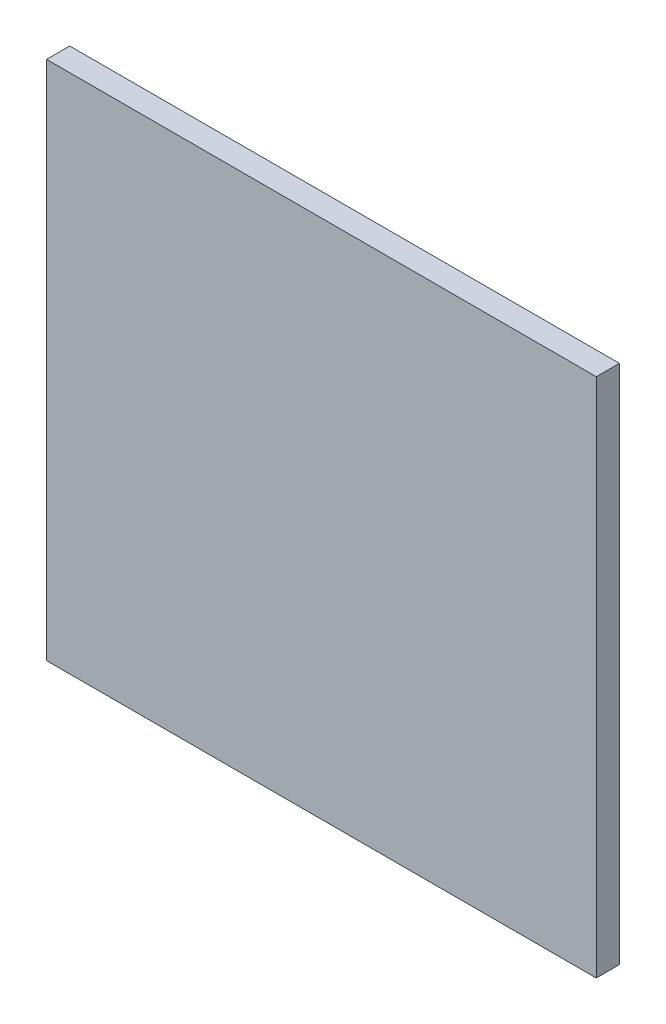
ISO-10303-21;
HEADER;
FILE_DESCRIPTION(('STEP AP214'),'2;1');
FILE_NAME('part.step','',(''),(''),'','','');
FILE_SCHEMA(('AUTOMOTIVE_DESIGN { 1 0 10303 214 1 1 1 1 }'));
ENDSEC;
DATA;
#1=APPLICATION_CONTEXT('core data for automotive mechanical design processes');
#2=APPLICATION_PROTOCOL_DEFINITION('international standard','automotive_design',2000,#1);
#3=PRODUCT_CONTEXT('',#1,'mechanical');
#4=PRODUCT('Part','Part','',(#3));
#5=PRODUCT_RELATED_PRODUCT_CATEGORY('part','',(#4));
#6=PRODUCT_DEFINITION_FORMATION('','',#4);
#7=PRODUCT_DEFINITION_CONTEXT('part definition',#1,'design');
#8=PRODUCT_DEFINITION('design','',#6,#7);
#9=PRODUCT_DEFINITION_SHAPE('','',#8);
#10=(LENGTH_UNIT() NAMED_UNIT(*) SI_UNIT(.MILLI.,.METRE.));
#11=(NAMED_UNIT(*) PLANE_ANGLE_UNIT() SI_UNIT($,.RADIAN.));
#12=(NAMED_UNIT(*) SI_UNIT($,.STERADIAN.) SOLID_ANGLE_UNIT());
#13=UNCERTAINTY_MEASURE_WITH_UNIT(LENGTH_MEASURE(1.E-05),#10,'distance_accuracy_value','');
#14=(GEOMETRIC_REPRESENTATION_CONTEXT(3) GLOBAL_UNCERTAINTY_ASSIGNED_CONTEXT((#13)) GLOBAL_UNIT_ASSIGNED_CONTEXT((#10,
#11,#12)) REPRESENTATION_CONTEXT('',''));
#15=CARTESIAN_POINT('',(0.,0.,0.));
#16=DIRECTION('',(0.,0.,1.));
#17=DIRECTION('',(1.,0.,0.));
#18=AXIS2_PLACEMENT_3D('',#15,#16,#17);
#19=CARTESIAN_POINT('',(0.,0.,1.6));
#20=DIRECTION('',(1.,0.,0.));
#21=DIRECTION('',(0.,1.,0.));
#22=AXIS2_PLACEMENT_3D('',#19,#20,#21);
#23=PLANE('',#22);
#24=DIRECTION('',(0.,-1.,0.));
#25=VECTOR('',#24,1.);
#26=CARTESIAN_POINT('',(0.,0.,0.));
#27=LINE('',#26,#25);
#28=CARTESIAN_POINT('',(0.,0.,0.));
#29=VERTEX_POINT('',#28);
#30=CARTESIAN_POINT('',(0.,-36.,0.));
#31=VERTEX_POINT('',#30);
#32=EDGE_CURVE('E96',#29,#31,#27,.T.);
#33=ORIENTED_EDGE('',*,*,#32,.T.);
#34=DIRECTION('',(0.,0.,-1.));
#35=VECTOR('',#34,1.);
#36=CARTESIAN_POINT('',(0.,-36.,1.6));
#37=LINE('',#36,#35);
#38=CARTESIAN_POINT('',(0.,-36.,1.6));
#39=VERTEX_POINT('',#38);
#40=EDGE_CURVE('E11',#39,#31,#37,.T.);
#41=ORIENTED_EDGE('',*,*,#40,.F.);
#42=DIRECTION('',(0.,-1.,0.));
#43=VECTOR('',#42,1.);
#44=CARTESIAN_POINT('',(0.,0.,1.6));
#45=LINE('',#44,#43);
#46=CARTESIAN_POINT('',(0.,0.,1.6));
#47=VERTEX_POINT('',#46);
#48=EDGE_CURVE('E84',#47,#39,#45,.T.);
#49=ORIENTED_EDGE('',*,*,#48,.F.);
#50=DIRECTION('',(0.,0.,-1.));
#51=VECTOR('',#50,1.);
#52=CARTESIAN_POINT('',(0.,0.,1.6));
#53=LINE('',#52,#51);
#54=EDGE_CURVE('E92',#47,#29,#53,.T.);
#55=ORIENTED_EDGE('',*,*,#54,.T.);
#56=EDGE_LOOP('',(#33,#41,#49,#55));
#57=FACE_BOUND('',#56,.T.);
#58=ADVANCED_FACE('F33',(#57),#23,.F.);
#59=CARTESIAN_POINT('',(0.,-36.,1.6));
#60=DIRECTION('',(0.,1.,0.));
#61=DIRECTION('',(0.,0.,1.));
#62=AXIS2_PLACEMENT_3D('',#59,#60,#61);
#63=PLANE('',#62);
#64=DIRECTION('',(1.,0.,0.));
#65=VECTOR('',#64,1.);
#66=CARTESIAN_POINT('',(0.,-36.,0.));
#67=LINE('',#66,#65);
#68=CARTESIAN_POINT('',(38.,-36.,0.));
#69=VERTEX_POINT('',#68);
#70=EDGE_CURVE('E88',#31,#69,#67,.T.);
#71=ORIENTED_EDGE('',*,*,#70,.T.);
#72=DIRECTION('',(0.,0.,-1.));
#73=VECTOR('',#72,1.);
#74=CARTESIAN_POINT('',(38.,-36.,1.6));
#75=LINE('',#74,#73);
#76=CARTESIAN_POINT('',(38.,-36.,1.6));
#77=VERTEX_POINT('',#76);
#78=EDGE_CURVE('E41',#77,#69,#75,.T.);
#79=ORIENTED_EDGE('',*,*,#78,.F.);
#80=DIRECTION('',(1.,0.,0.));
#81=VECTOR('',#80,1.);
#82=CARTESIAN_POINT('',(0.,-36.,1.6));
#83=LINE('',#82,#81);
#84=EDGE_CURVE('E79',#39,#77,#83,.T.);
#85=ORIENTED_EDGE('',*,*,#84,.F.);
#86=ORIENTED_EDGE('',*,*,#40,.T.);
#87=EDGE_LOOP('',(#71,#79,#85,#86));
#88=FACE_BOUND('',#87,.T.);
#89=ADVANCED_FACE('F87',(#88),#63,.F.);
#90=CARTESIAN_POINT('',(38.,0.,1.6));
#91=DIRECTION('',(-1.,0.,0.));
#92=DIRECTION('',(0.,-1.,0.));
#93=AXIS2_PLACEMENT_3D('',#90,#91,#92);
#94=PLANE('',#93);
#95=DIRECTION('',(0.,1.,0.));
#96=VECTOR('',#95,1.);
#97=CARTESIAN_POINT('',(38.,0.,0.));
#98=LINE('',#97,#96);
#99=CARTESIAN_POINT('',(38.,0.,0.));
#100=VERTEX_POINT('',#99);
#101=EDGE_CURVE('E66',#69,#100,#98,.T.);
#102=ORIENTED_EDGE('',*,*,#101,.T.);
#103=DIRECTION('',(0.,0.,-1.));
#104=VECTOR('',#103,1.);
#105=CARTESIAN_POINT('',(38.,0.,1.6));
#106=LINE('',#105,#104);
#107=CARTESIAN_POINT('',(38.,0.,1.6));
#108=VERTEX_POINT('',#107);
#109=EDGE_CURVE('E89',#108,#100,#106,.T.);
#110=ORIENTED_EDGE('',*,*,#109,.F.);
#111=DIRECTION('',(0.,1.,0.));
#112=VECTOR('',#111,1.);
#113=CARTESIAN_POINT('',(38.,0.,1.6));
#114=LINE('',#113,#112);
#115=EDGE_CURVE('E82',#77,#108,#114,.T.);
#116=ORIENTED_EDGE('',*,*,#115,.F.);
#117=ORIENTED_EDGE('',*,*,#78,.T.);
#118=EDGE_LOOP('',(#102,#110,#116,#117));
#119=FACE_BOUND('',#118,.T.);
#120=ADVANCED_FACE('F90',(#119),#94,.F.);
#121=CARTESIAN_POINT('',(0.,0.,1.6));
#122=DIRECTION('',(0.,-1.,0.));
#123=DIRECTION('',(0.,0.,-1.));
#124=AXIS2_PLACEMENT_3D('',#121,#122,#123);
#125=PLANE('',#124);
#126=DIRECTION('',(-1.,0.,0.));
#127=VECTOR('',#126,1.);
#128=CARTESIAN_POINT('',(0.,0.,0.));
#129=LINE('',#128,#127);
#130=EDGE_CURVE('E72',#100,#29,#129,.T.);
#131=ORIENTED_EDGE('',*,*,#130,.T.);
#132=ORIENTED_EDGE('',*,*,#54,.F.);
#133=DIRECTION('',(-1.,0.,0.));
#134=VECTOR('',#133,1.);
#135=CARTESIAN_POINT('',(0.,0.,1.6));
#136=LINE('',#135,#134);
#137=EDGE_CURVE('E49',#108,#47,#136,.T.);
#138=ORIENTED_EDGE('',*,*,#137,.F.);
#139=ORIENTED_EDGE('',*,*,#109,.T.);
#140=EDGE_LOOP('',(#131,#132,#138,#139));
#141=FACE_BOUND('',#140,.T.);
#142=ADVANCED_FACE('F103',(#141),#125,.F.);
#143=CARTESIAN_POINT('',(0.,0.,1.6));
#144=DIRECTION('',(0.,0.,1.));
#145=DIRECTION('',(1.,0.,0.));
#146=AXIS2_PLACEMENT_3D('',#143,#144,#145);
#147=PLANE('',#146);
#148=ORIENTED_EDGE('',*,*,#48,.T.);
#149=ORIENTED_EDGE('',*,*,#84,.T.);
#150=ORIENTED_EDGE('',*,*,#115,.T.);
#151=ORIENTED_EDGE('',*,*,#137,.T.);
#152=EDGE_LOOP('',(#148,#149,#150,#151));
#153=FACE_BOUND('',#152,.T.);
#154=ADVANCED_FACE('F80',(#153),#147,.T.);
#155=CARTESIAN_POINT('',(0.,0.,0.));
#156=DIRECTION('',(0.,0.,1.));
#157=DIRECTION('',(1.,0.,0.));
#158=AXIS2_PLACEMENT_3D('',#155,#156,#157);
#159=PLANE('',#158);
#160=ORIENTED_EDGE('',*,*,#32,.F.);
#161=ORIENTED_EDGE('',*,*,#130,.F.);
#162=ORIENTED_EDGE('',*,*,#101,.F.);
#163=ORIENTED_EDGE('',*,*,#70,.F.);
#164=EDGE_LOOP('',(#160,#161,#162,#163));
#165=FACE_BOUND('',#164,.T.);
#166=ADVANCED_FACE('F106',(#165),#159,.F.);
#167=CLOSED_SHELL('',(#58,#89,#120,#142,#154,#166));
#168=MANIFOLD_SOLID_BREP('B2',#167);
#169=ADVANCED_BREP_SHAPE_REPRESENTATION('',(#18,#168),#14);
#170=SHAPE_DEFINITION_REPRESENTATION(#9,#169);
ENDSEC;
END-ISO-10303-21;
